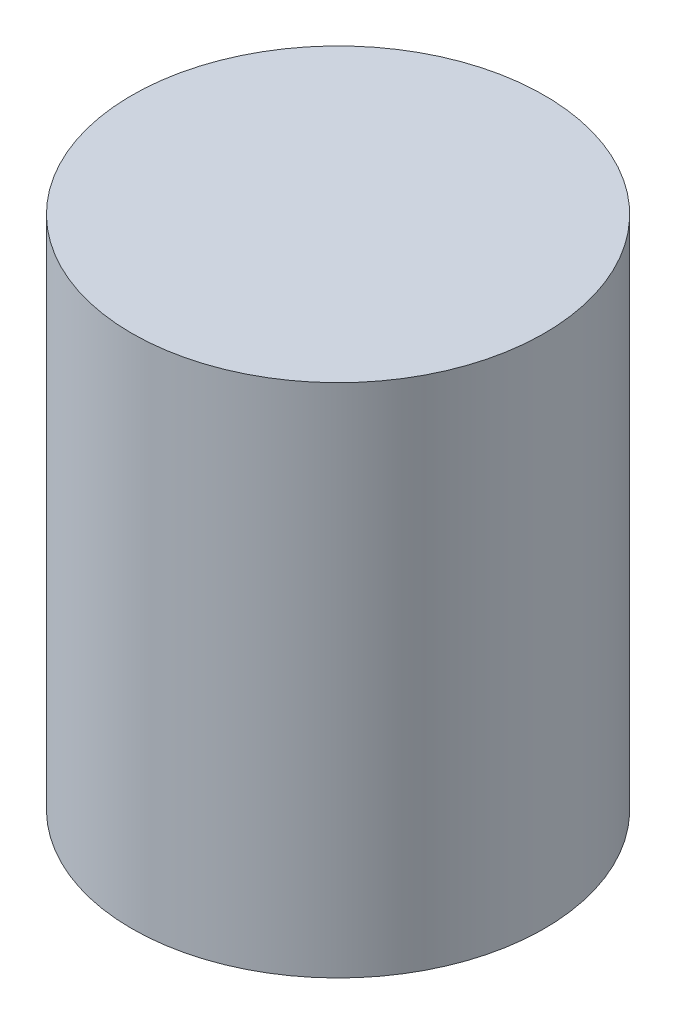
ISO-10303-21;
HEADER;
FILE_DESCRIPTION(('STEP AP214'),'2;1');
FILE_NAME('part.step','',(''),(''),'','','');
FILE_SCHEMA(('AUTOMOTIVE_DESIGN { 1 0 10303 214 1 1 1 1 }'));
ENDSEC;
DATA;
#1=APPLICATION_CONTEXT('core data for automotive mechanical design processes');
#2=APPLICATION_PROTOCOL_DEFINITION('international standard','automotive_design',2000,#1);
#3=PRODUCT_CONTEXT('',#1,'mechanical');
#4=PRODUCT('Part','Part','',(#3));
#5=PRODUCT_RELATED_PRODUCT_CATEGORY('part','',(#4));
#6=PRODUCT_DEFINITION_FORMATION('','',#4);
#7=PRODUCT_DEFINITION_CONTEXT('part definition',#1,'design');
#8=PRODUCT_DEFINITION('design','',#6,#7);
#9=PRODUCT_DEFINITION_SHAPE('','',#8);
#10=(LENGTH_UNIT() NAMED_UNIT(*) SI_UNIT(.MILLI.,.METRE.));
#11=(NAMED_UNIT(*) PLANE_ANGLE_UNIT() SI_UNIT($,.RADIAN.));
#12=(NAMED_UNIT(*) SI_UNIT($,.STERADIAN.) SOLID_ANGLE_UNIT());
#13=UNCERTAINTY_MEASURE_WITH_UNIT(LENGTH_MEASURE(1.E-05),#10,'distance_accuracy_value','');
#14=(GEOMETRIC_REPRESENTATION_CONTEXT(3) GLOBAL_UNCERTAINTY_ASSIGNED_CONTEXT((#13)) GLOBAL_UNIT_ASSIGNED_CONTEXT((#10,
#11,#12)) REPRESENTATION_CONTEXT('',''));
#15=CARTESIAN_POINT('',(0.,0.,0.));
#16=DIRECTION('',(0.,0.,1.));
#17=DIRECTION('',(1.,0.,0.));
#18=AXIS2_PLACEMENT_3D('',#15,#16,#17);
#19=CARTESIAN_POINT('',(0.,100.,0.));
#20=DIRECTION('',(0.,-1.,0.));
#21=DIRECTION('',(0.,0.,-1.));
#22=AXIS2_PLACEMENT_3D('',#19,#20,#21);
#23=CYLINDRICAL_SURFACE('',#22,40.);
#24=CARTESIAN_POINT('',(0.,100.,0.));
#25=DIRECTION('',(0.,1.,0.));
#26=DIRECTION('',(0.,0.,1.));
#27=AXIS2_PLACEMENT_3D('',#24,#25,#26);
#28=CIRCLE('',#27,40.);
#29=CARTESIAN_POINT('',(0.,100.,40.));
#30=VERTEX_POINT('',#29);
#31=EDGE_CURVE('E10',#30,#30,#28,.T.);
#32=ORIENTED_EDGE('',*,*,#31,.F.);
#33=EDGE_LOOP('',(#32));
#34=FACE_BOUND('',#33,.T.);
#35=CARTESIAN_POINT('',(0.,0.,0.));
#36=DIRECTION('',(0.,1.,0.));
#37=DIRECTION('',(0.,0.,1.));
#38=AXIS2_PLACEMENT_3D('',#35,#36,#37);
#39=CIRCLE('',#38,40.);
#40=CARTESIAN_POINT('',(0.,0.,40.));
#41=VERTEX_POINT('',#40);
#42=EDGE_CURVE('E40',#41,#41,#39,.T.);
#43=ORIENTED_EDGE('',*,*,#42,.T.);
#44=EDGE_LOOP('',(#43));
#45=FACE_BOUND('',#44,.T.);
#46=ADVANCED_FACE('F37',(#34,#45),#23,.T.);
#47=CARTESIAN_POINT('',(0.,100.,0.));
#48=DIRECTION('',(0.,1.,0.));
#49=DIRECTION('',(0.,0.,1.));
#50=AXIS2_PLACEMENT_3D('',#47,#48,#49);
#51=PLANE('',#50);
#52=ORIENTED_EDGE('',*,*,#31,.T.);
#53=EDGE_LOOP('',(#52));
#54=FACE_BOUND('',#53,.T.);
#55=ADVANCED_FACE('F52',(#54),#51,.T.);
#56=CARTESIAN_POINT('',(0.,0.,0.));
#57=DIRECTION('',(0.,1.,0.));
#58=DIRECTION('',(0.,0.,1.));
#59=AXIS2_PLACEMENT_3D('',#56,#57,#58);
#60=PLANE('',#59);
#61=ORIENTED_EDGE('',*,*,#42,.F.);
#62=EDGE_LOOP('',(#61));
#63=FACE_BOUND('',#62,.T.);
#64=ADVANCED_FACE('F50',(#63),#60,.F.);
#65=CLOSED_SHELL('',(#46,#55,#64));
#66=MANIFOLD_SOLID_BREP('B2',#65);
#67=ADVANCED_BREP_SHAPE_REPRESENTATION('',(#18,#66),#14);
#68=SHAPE_DEFINITION_REPRESENTATION(#9,#67);
ENDSEC;
END-ISO-10303-21;
